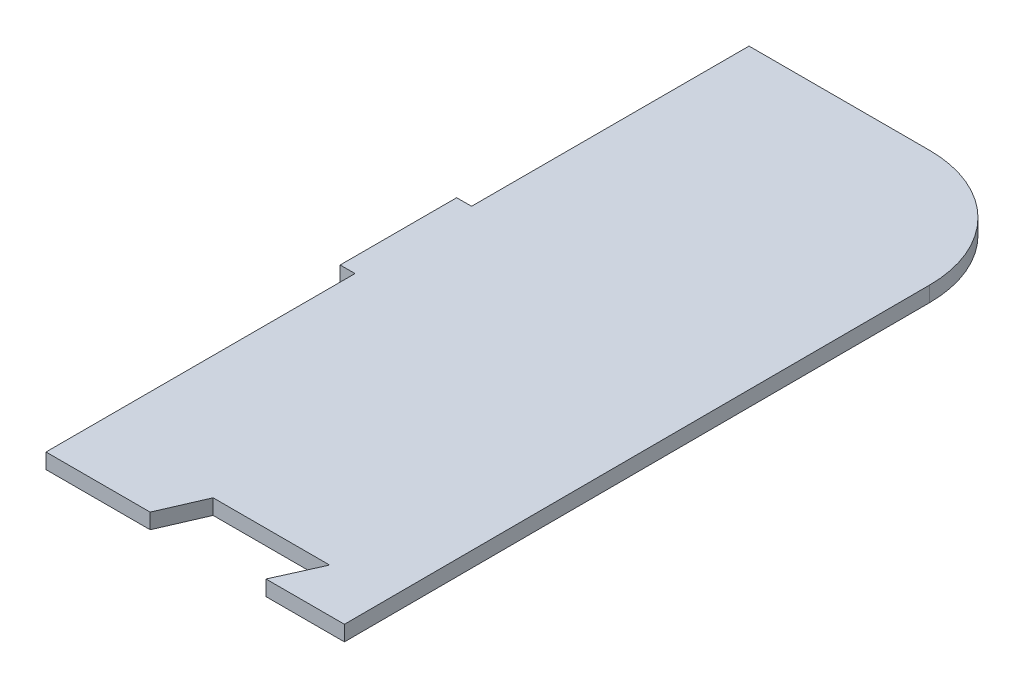
ISO-10303-21;
HEADER;
FILE_DESCRIPTION(('STEP AP214'),'2;1');
FILE_NAME('part.step','',(''),(''),'','','');
FILE_SCHEMA(('AUTOMOTIVE_DESIGN { 1 0 10303 214 1 1 1 1 }'));
ENDSEC;
DATA;
#1=APPLICATION_CONTEXT('core data for automotive mechanical design processes');
#2=APPLICATION_PROTOCOL_DEFINITION('international standard','automotive_design',2000,#1);
#3=PRODUCT_CONTEXT('',#1,'mechanical');
#4=PRODUCT('Part','Part','',(#3));
#5=PRODUCT_RELATED_PRODUCT_CATEGORY('part','',(#4));
#6=PRODUCT_DEFINITION_FORMATION('','',#4);
#7=PRODUCT_DEFINITION_CONTEXT('part definition',#1,'design');
#8=PRODUCT_DEFINITION('design','',#6,#7);
#9=PRODUCT_DEFINITION_SHAPE('','',#8);
#10=(LENGTH_UNIT() NAMED_UNIT(*) SI_UNIT(.MILLI.,.METRE.));
#11=(NAMED_UNIT(*) PLANE_ANGLE_UNIT() SI_UNIT($,.RADIAN.));
#12=(NAMED_UNIT(*) SI_UNIT($,.STERADIAN.) SOLID_ANGLE_UNIT());
#13=UNCERTAINTY_MEASURE_WITH_UNIT(LENGTH_MEASURE(1.E-05),#10,'distance_accuracy_value','');
#14=(GEOMETRIC_REPRESENTATION_CONTEXT(3) GLOBAL_UNCERTAINTY_ASSIGNED_CONTEXT((#13)) GLOBAL_UNIT_ASSIGNED_CONTEXT((#10,
#11,#12)) REPRESENTATION_CONTEXT('',''));
#15=CARTESIAN_POINT('',(0.,0.,0.));
#16=DIRECTION('',(0.,0.,1.));
#17=DIRECTION('',(1.,0.,0.));
#18=AXIS2_PLACEMENT_3D('',#15,#16,#17);
#19=CARTESIAN_POINT('',(358.121789204402,754.380000017288,884.700014425757));
#20=DIRECTION('',(0.,-1.,0.));
#21=DIRECTION('',(0.,0.,-1.));
#22=AXIS2_PLACEMENT_3D('',#19,#20,#21);
#23=PLANE('',#22);
#24=DIRECTION('',(-0.00203401334707627,0.,-0.999997931392712));
#25=VECTOR('',#24,1.);
#26=CARTESIAN_POINT('',(460.501916297315,754.380000017288,459.74));
#27=LINE('',#26,#25);
#28=CARTESIAN_POINT('',(460.501916297315,754.380000017288,459.739999999993));
#29=VERTEX_POINT('',#28);
#30=CARTESIAN_POINT('',(459.721789204401,754.380000017288,76.2000000000132));
#31=VERTEX_POINT('',#30);
#32=EDGE_CURVE('E111',#29,#31,#27,.T.);
#33=ORIENTED_EDGE('',*,*,#32,.T.);
#34=CARTESIAN_POINT('',(383.521789204401,754.380000017288,76.2000000000132));
#35=DIRECTION('',(0.,1.,0.));
#36=DIRECTION('',(0.,0.,1.));
#37=AXIS2_PLACEMENT_3D('',#34,#35,#36);
#38=CIRCLE('',#37,76.2);
#39=CARTESIAN_POINT('',(383.521789204398,754.380000017288,0.));
#40=VERTEX_POINT('',#39);
#41=EDGE_CURVE('E246',#31,#40,#38,.T.);
#42=ORIENTED_EDGE('',*,*,#41,.T.);
#43=DIRECTION('',(-1.,0.,0.));
#44=VECTOR('',#43,1.);
#45=CARTESIAN_POINT('',(358.121789204402,754.380000017288,0.));
#46=LINE('',#45,#44);
#47=CARTESIAN_POINT('',(265.355188860333,754.380000017288,0.));
#48=VERTEX_POINT('',#47);
#49=EDGE_CURVE('E216',#40,#48,#46,.T.);
#50=ORIENTED_EDGE('',*,*,#49,.T.);
#51=DIRECTION('',(0.,0.,-1.));
#52=VECTOR('',#51,1.);
#53=CARTESIAN_POINT('',(265.355188860333,754.380000017288,0.));
#54=LINE('',#53,#52);
#55=CARTESIAN_POINT('',(265.355188860333,754.380000017288,181.46005910007));
#56=VERTEX_POINT('',#55);
#57=EDGE_CURVE('E211',#56,#48,#54,.T.);
#58=ORIENTED_EDGE('',*,*,#57,.F.);
#59=DIRECTION('',(-1.,0.,0.));
#60=VECTOR('',#59,1.);
#61=CARTESIAN_POINT('',(0.,754.380000017288,181.46005910007));
#62=LINE('',#61,#60);
#63=CARTESIAN_POINT('',(255.630013474232,754.380000017288,181.46005910007));
#64=VERTEX_POINT('',#63);
#65=EDGE_CURVE('E195',#56,#64,#62,.T.);
#66=ORIENTED_EDGE('',*,*,#65,.T.);
#67=DIRECTION('',(0.,0.,1.));
#68=VECTOR('',#67,1.);
#69=CARTESIAN_POINT('',(255.630013474232,754.380000017288,0.));
#70=LINE('',#69,#68);
#71=CARTESIAN_POINT('',(255.630013474232,754.380000017288,257.66005910007));
#72=VERTEX_POINT('',#71);
#73=EDGE_CURVE('E209',#64,#72,#70,.T.);
#74=ORIENTED_EDGE('',*,*,#73,.T.);
#75=DIRECTION('',(-1.,0.,0.));
#76=VECTOR('',#75,1.);
#77=CARTESIAN_POINT('',(0.,754.380000017288,257.66005910007));
#78=LINE('',#77,#76);
#79=CARTESIAN_POINT('',(265.355188860333,754.380000017288,257.66005910007));
#80=VERTEX_POINT('',#79);
#81=EDGE_CURVE('E283',#80,#72,#78,.T.);
#82=ORIENTED_EDGE('',*,*,#81,.F.);
#83=DIRECTION('',(0.,0.,-1.));
#84=VECTOR('',#83,1.);
#85=CARTESIAN_POINT('',(265.355188860333,754.380000017288,0.));
#86=LINE('',#85,#84);
#87=CARTESIAN_POINT('',(265.355188860333,754.380000017288,459.739999999993));
#88=VERTEX_POINT('',#87);
#89=EDGE_CURVE('E212',#88,#80,#86,.T.);
#90=ORIENTED_EDGE('',*,*,#89,.F.);
#91=DIRECTION('',(-1.,0.,0.));
#92=VECTOR('',#91,1.);
#93=CARTESIAN_POINT('',(358.121789204402,754.380000017288,459.739999999993));
#94=LINE('',#93,#92);
#95=CARTESIAN_POINT('',(333.46423455215,754.380000017288,459.739999999993));
#96=VERTEX_POINT('',#95);
#97=EDGE_CURVE('E227',#96,#88,#94,.T.);
#98=ORIENTED_EDGE('',*,*,#97,.F.);
#99=DIRECTION('',(0.398405108065025,0.,-0.917209556136271));
#100=VECTOR('',#99,1.);
#101=CARTESIAN_POINT('',(333.464234552153,754.380000017288,459.74));
#102=LINE('',#101,#100);
#103=CARTESIAN_POINT('',(345.930527537437,754.380000017288,431.040059100068));
#104=VERTEX_POINT('',#103);
#105=EDGE_CURVE('E265',#96,#104,#102,.T.);
#106=ORIENTED_EDGE('',*,*,#105,.T.);
#107=DIRECTION('',(1.,0.,0.));
#108=VECTOR('',#107,1.);
#109=CARTESIAN_POINT('',(345.930527537437,754.380000017288,431.040059100068));
#110=LINE('',#109,#108);
#111=CARTESIAN_POINT('',(422.130527537437,754.380000017288,431.040059100068));
#112=VERTEX_POINT('',#111);
#113=EDGE_CURVE('E273',#104,#112,#110,.T.);
#114=ORIENTED_EDGE('',*,*,#113,.T.);
#115=DIRECTION('',(-0.410331561317546,0.,0.911936406657123));
#116=VECTOR('',#115,1.);
#117=CARTESIAN_POINT('',(422.130527537437,754.380000017288,431.040059100068));
#118=LINE('',#117,#116);
#119=CARTESIAN_POINT('',(409.216807377542,754.380000017288,459.739999999993));
#120=VERTEX_POINT('',#119);
#121=EDGE_CURVE('E276',#112,#120,#118,.T.);
#122=ORIENTED_EDGE('',*,*,#121,.T.);
#123=EDGE_CURVE('E233',#29,#120,#94,.T.);
#124=ORIENTED_EDGE('',*,*,#123,.F.);
#125=EDGE_LOOP('',(#33,#42,#50,#58,#66,#74,#82,#90,#98,#106,#114,#122,#124));
#126=FACE_BOUND('',#125,.T.);
#127=ADVANCED_FACE('F96',(#126),#23,.F.);
#128=CARTESIAN_POINT('',(562.803601280852,744.380000017288,884.700014425757));
#129=DIRECTION('',(0.,1.,0.));
#130=DIRECTION('',(0.,0.,1.));
#131=AXIS2_PLACEMENT_3D('',#128,#129,#130);
#132=PLANE('',#131);
#133=DIRECTION('',(-0.00203401334707627,0.,-0.999997931392713));
#134=VECTOR('',#133,1.);
#135=CARTESIAN_POINT('',(461.366712094164,744.380000017288,884.906338839052));
#136=LINE('',#135,#134);
#137=CARTESIAN_POINT('',(460.501916297315,744.380000017288,459.739999999993));
#138=VERTEX_POINT('',#137);
#139=CARTESIAN_POINT('',(459.721789204401,744.380000017288,76.2000000000132));
#140=VERTEX_POINT('',#139);
#141=EDGE_CURVE('E299',#138,#140,#136,.T.);
#142=ORIENTED_EDGE('',*,*,#141,.F.);
#143=DIRECTION('',(1.,0.,0.));
#144=VECTOR('',#143,1.);
#145=CARTESIAN_POINT('',(562.803601280852,744.380000017288,459.739999999993));
#146=LINE('',#145,#144);
#147=CARTESIAN_POINT('',(409.216807377545,744.380000017288,459.739999999993));
#148=VERTEX_POINT('',#147);
#149=EDGE_CURVE('E229',#148,#138,#146,.T.);
#150=ORIENTED_EDGE('',*,*,#149,.F.);
#151=DIRECTION('',(-0.410331561317546,0.,0.911936406657123));
#152=VECTOR('',#151,1.);
#153=CARTESIAN_POINT('',(276.058060925519,744.380000017288,755.677042630876));
#154=LINE('',#153,#152);
#155=CARTESIAN_POINT('',(422.130527537437,744.380000017288,431.040059100068));
#156=VERTEX_POINT('',#155);
#157=EDGE_CURVE('E119',#156,#148,#154,.T.);
#158=ORIENTED_EDGE('',*,*,#157,.F.);
#159=DIRECTION('',(1.,0.,0.));
#160=VECTOR('',#159,1.);
#161=CARTESIAN_POINT('',(562.803601280852,744.380000017288,431.040059100068));
#162=LINE('',#161,#160);
#163=CARTESIAN_POINT('',(345.930527537437,744.380000017288,431.040059100068));
#164=VERTEX_POINT('',#163);
#165=EDGE_CURVE('E12',#164,#156,#162,.T.);
#166=ORIENTED_EDGE('',*,*,#165,.F.);
#167=DIRECTION('',(0.398405108065025,0.,-0.917209556136271));
#168=VECTOR('',#167,1.);
#169=CARTESIAN_POINT('',(214.577197716529,744.380000017288,733.442129011262));
#170=LINE('',#169,#168);
#171=CARTESIAN_POINT('',(333.46423455215,744.380000017288,459.739999999993));
#172=VERTEX_POINT('',#171);
#173=EDGE_CURVE('E297',#172,#164,#170,.T.);
#174=ORIENTED_EDGE('',*,*,#173,.F.);
#175=CARTESIAN_POINT('',(265.355188860333,744.380000017288,459.739999999993));
#176=VERTEX_POINT('',#175);
#177=EDGE_CURVE('E232',#176,#172,#146,.T.);
#178=ORIENTED_EDGE('',*,*,#177,.F.);
#179=DIRECTION('',(0.,0.,-1.));
#180=VECTOR('',#179,1.);
#181=CARTESIAN_POINT('',(265.355188860333,744.380000017288,884.700014425757));
#182=LINE('',#181,#180);
#183=CARTESIAN_POINT('',(265.355188860333,744.380000017288,257.66005910007));
#184=VERTEX_POINT('',#183);
#185=EDGE_CURVE('E293',#176,#184,#182,.T.);
#186=ORIENTED_EDGE('',*,*,#185,.T.);
#187=DIRECTION('',(-1.,0.,0.));
#188=VECTOR('',#187,1.);
#189=CARTESIAN_POINT('',(562.803601280852,744.380000017288,257.66005910007));
#190=LINE('',#189,#188);
#191=CARTESIAN_POINT('',(255.630013474232,744.380000017288,257.66005910007));
#192=VERTEX_POINT('',#191);
#193=EDGE_CURVE('E288',#184,#192,#190,.T.);
#194=ORIENTED_EDGE('',*,*,#193,.T.);
#195=DIRECTION('',(0.,0.,1.));
#196=VECTOR('',#195,1.);
#197=CARTESIAN_POINT('',(255.630013474232,744.380000017288,0.));
#198=LINE('',#197,#196);
#199=CARTESIAN_POINT('',(255.630013474232,744.380000017288,181.46005910007));
#200=VERTEX_POINT('',#199);
#201=EDGE_CURVE('E217',#200,#192,#198,.T.);
#202=ORIENTED_EDGE('',*,*,#201,.F.);
#203=DIRECTION('',(-1.,0.,0.));
#204=VECTOR('',#203,1.);
#205=CARTESIAN_POINT('',(562.803601280852,744.380000017288,181.46005910007));
#206=LINE('',#205,#204);
#207=CARTESIAN_POINT('',(265.355188860333,744.380000017288,181.46005910007));
#208=VERTEX_POINT('',#207);
#209=EDGE_CURVE('E198',#208,#200,#206,.T.);
#210=ORIENTED_EDGE('',*,*,#209,.F.);
#211=DIRECTION('',(0.,0.,-1.));
#212=VECTOR('',#211,1.);
#213=CARTESIAN_POINT('',(265.355188860333,744.380000017288,884.700014425757));
#214=LINE('',#213,#212);
#215=CARTESIAN_POINT('',(265.355188860333,744.380000017288,0.));
#216=VERTEX_POINT('',#215);
#217=EDGE_CURVE('E300',#208,#216,#214,.T.);
#218=ORIENTED_EDGE('',*,*,#217,.T.);
#219=DIRECTION('',(1.,0.,0.));
#220=VECTOR('',#219,1.);
#221=CARTESIAN_POINT('',(562.803601280852,744.380000017288,0.));
#222=LINE('',#221,#220);
#223=CARTESIAN_POINT('',(383.521789204398,744.380000017288,0.));
#224=VERTEX_POINT('',#223);
#225=EDGE_CURVE('E219',#216,#224,#222,.T.);
#226=ORIENTED_EDGE('',*,*,#225,.T.);
#227=CARTESIAN_POINT('',(383.521789204401,744.380000017288,76.2000000000132));
#228=DIRECTION('',(0.,1.,0.));
#229=DIRECTION('',(0.,0.,1.));
#230=AXIS2_PLACEMENT_3D('',#227,#228,#229);
#231=CIRCLE('',#230,76.2);
#232=EDGE_CURVE('E221',#140,#224,#231,.T.);
#233=ORIENTED_EDGE('',*,*,#232,.F.);
#234=EDGE_LOOP('',(#142,#150,#158,#166,#174,#178,#186,#194,#202,#210,#218,#226,#233));
#235=FACE_BOUND('',#234,.T.);
#236=ADVANCED_FACE('F303',(#235),#132,.F.);
#237=CARTESIAN_POINT('',(-0.0522024421950805,0.751580454716461,459.739999999993));
#238=DIRECTION('',(0.,0.,1.));
#239=DIRECTION('',(1.,0.,0.));
#240=AXIS2_PLACEMENT_3D('',#237,#238,#239);
#241=PLANE('',#240);
#242=ORIENTED_EDGE('',*,*,#149,.T.);
#243=DIRECTION('',(0.,1.,0.));
#244=VECTOR('',#243,1.);
#245=CARTESIAN_POINT('',(460.501916297315,0.751580454716461,459.739999999993));
#246=LINE('',#245,#244);
#247=EDGE_CURVE('E239',#138,#29,#246,.T.);
#248=ORIENTED_EDGE('',*,*,#247,.T.);
#249=ORIENTED_EDGE('',*,*,#123,.T.);
#250=DIRECTION('',(0.,-1.,0.));
#251=VECTOR('',#250,1.);
#252=CARTESIAN_POINT('',(409.216807377545,691.380000017288,459.739999999993));
#253=LINE('',#252,#251);
#254=EDGE_CURVE('E270',#120,#148,#253,.T.);
#255=ORIENTED_EDGE('',*,*,#254,.T.);
#256=EDGE_LOOP('',(#242,#248,#249,#255));
#257=FACE_BOUND('',#256,.T.);
#258=ADVANCED_FACE('F98',(#257),#241,.T.);
#259=ORIENTED_EDGE('',*,*,#177,.T.);
#260=DIRECTION('',(0.,1.,0.));
#261=VECTOR('',#260,1.);
#262=CARTESIAN_POINT('',(333.464234552156,0.751580454716461,459.739999999993));
#263=LINE('',#262,#261);
#264=EDGE_CURVE('E203',#172,#96,#263,.T.);
#265=ORIENTED_EDGE('',*,*,#264,.T.);
#266=ORIENTED_EDGE('',*,*,#97,.T.);
#267=DIRECTION('',(0.,1.,0.));
#268=VECTOR('',#267,1.);
#269=CARTESIAN_POINT('',(265.355188860333,691.380000017288,459.739999999993));
#270=LINE('',#269,#268);
#271=EDGE_CURVE('E286',#176,#88,#270,.T.);
#272=ORIENTED_EDGE('',*,*,#271,.F.);
#273=EDGE_LOOP('',(#259,#265,#266,#272));
#274=FACE_BOUND('',#273,.T.);
#275=ADVANCED_FACE('F328',(#274),#241,.T.);
#276=CARTESIAN_POINT('',(255.630013474232,754.380000017288,0.));
#277=DIRECTION('',(1.,0.,0.));
#278=DIRECTION('',(0.,0.,-1.));
#279=AXIS2_PLACEMENT_3D('',#276,#277,#278);
#280=PLANE('',#279);
#281=DIRECTION('',(0.,1.,0.));
#282=VECTOR('',#281,1.);
#283=CARTESIAN_POINT('',(255.630013474232,754.380000017288,181.46005910007));
#284=LINE('',#283,#282);
#285=EDGE_CURVE('E191',#200,#64,#284,.T.);
#286=ORIENTED_EDGE('',*,*,#285,.F.);
#287=ORIENTED_EDGE('',*,*,#201,.T.);
#288=DIRECTION('',(0.,1.,0.));
#289=VECTOR('',#288,1.);
#290=CARTESIAN_POINT('',(255.630013474232,754.380000017288,257.66005910007));
#291=LINE('',#290,#289);
#292=EDGE_CURVE('E204',#192,#72,#291,.T.);
#293=ORIENTED_EDGE('',*,*,#292,.T.);
#294=ORIENTED_EDGE('',*,*,#73,.F.);
#295=EDGE_LOOP('',(#286,#287,#293,#294));
#296=FACE_BOUND('',#295,.T.);
#297=ADVANCED_FACE('F215',(#296),#280,.F.);
#298=CARTESIAN_POINT('',(0.,0.,0.));
#299=DIRECTION('',(0.,0.,-1.));
#300=DIRECTION('',(-1.,0.,0.));
#301=AXIS2_PLACEMENT_3D('',#298,#299,#300);
#302=PLANE('',#301);
#303=DIRECTION('',(0.,1.,0.));
#304=VECTOR('',#303,1.);
#305=CARTESIAN_POINT('',(383.521789204401,691.380000017288,6.60582699651968E-12));
#306=LINE('',#305,#304);
#307=EDGE_CURVE('E104',#224,#40,#306,.T.);
#308=ORIENTED_EDGE('',*,*,#307,.F.);
#309=ORIENTED_EDGE('',*,*,#225,.F.);
#310=DIRECTION('',(0.,1.,0.));
#311=VECTOR('',#310,1.);
#312=CARTESIAN_POINT('',(265.355188860333,691.380000017288,0.));
#313=LINE('',#312,#311);
#314=EDGE_CURVE('E252',#216,#48,#313,.T.);
#315=ORIENTED_EDGE('',*,*,#314,.T.);
#316=ORIENTED_EDGE('',*,*,#49,.F.);
#317=EDGE_LOOP('',(#308,#309,#315,#316));
#318=FACE_BOUND('',#317,.T.);
#319=ADVANCED_FACE('F255',(#318),#302,.T.);
#320=CARTESIAN_POINT('',(265.355188860333,691.380000017288,0.));
#321=DIRECTION('',(1.,0.,0.));
#322=DIRECTION('',(0.,0.,-1.));
#323=AXIS2_PLACEMENT_3D('',#320,#321,#322);
#324=PLANE('',#323);
#325=ORIENTED_EDGE('',*,*,#271,.T.);
#326=ORIENTED_EDGE('',*,*,#89,.T.);
#327=DIRECTION('',(0.,1.,0.));
#328=VECTOR('',#327,1.);
#329=CARTESIAN_POINT('',(265.355188860333,691.380000017288,257.66005910007));
#330=LINE('',#329,#328);
#331=EDGE_CURVE('E285',#184,#80,#330,.T.);
#332=ORIENTED_EDGE('',*,*,#331,.F.);
#333=ORIENTED_EDGE('',*,*,#185,.F.);
#334=EDGE_LOOP('',(#325,#326,#332,#333));
#335=FACE_BOUND('',#334,.T.);
#336=ADVANCED_FACE('F314',(#335),#324,.F.);
#337=CARTESIAN_POINT('',(0.,691.380000017288,257.66005910007));
#338=DIRECTION('',(0.,0.,-1.));
#339=DIRECTION('',(-1.,0.,0.));
#340=AXIS2_PLACEMENT_3D('',#337,#338,#339);
#341=PLANE('',#340);
#342=ORIENTED_EDGE('',*,*,#331,.T.);
#343=ORIENTED_EDGE('',*,*,#81,.T.);
#344=ORIENTED_EDGE('',*,*,#292,.F.);
#345=ORIENTED_EDGE('',*,*,#193,.F.);
#346=EDGE_LOOP('',(#342,#343,#344,#345));
#347=FACE_BOUND('',#346,.T.);
#348=ADVANCED_FACE('F306',(#347),#341,.F.);
#349=CARTESIAN_POINT('',(265.355188860333,691.380000017288,0.));
#350=DIRECTION('',(1.,0.,0.));
#351=DIRECTION('',(0.,0.,-1.));
#352=AXIS2_PLACEMENT_3D('',#349,#350,#351);
#353=PLANE('',#352);
#354=DIRECTION('',(0.,1.,0.));
#355=VECTOR('',#354,1.);
#356=CARTESIAN_POINT('',(265.355188860333,691.380000017288,181.46005910007));
#357=LINE('',#356,#355);
#358=EDGE_CURVE('E258',#208,#56,#357,.T.);
#359=ORIENTED_EDGE('',*,*,#358,.T.);
#360=ORIENTED_EDGE('',*,*,#57,.T.);
#361=ORIENTED_EDGE('',*,*,#314,.F.);
#362=ORIENTED_EDGE('',*,*,#217,.F.);
#363=EDGE_LOOP('',(#359,#360,#361,#362));
#364=FACE_BOUND('',#363,.T.);
#365=ADVANCED_FACE('F304',(#364),#353,.F.);
#366=CARTESIAN_POINT('',(0.,691.380000017288,181.46005910007));
#367=DIRECTION('',(0.,0.,-1.));
#368=DIRECTION('',(-1.,0.,0.));
#369=AXIS2_PLACEMENT_3D('',#366,#367,#368);
#370=PLANE('',#369);
#371=ORIENTED_EDGE('',*,*,#209,.T.);
#372=ORIENTED_EDGE('',*,*,#285,.T.);
#373=ORIENTED_EDGE('',*,*,#65,.F.);
#374=ORIENTED_EDGE('',*,*,#358,.F.);
#375=EDGE_LOOP('',(#371,#372,#373,#374));
#376=FACE_BOUND('',#375,.T.);
#377=ADVANCED_FACE('F193',(#376),#370,.T.);
#378=CARTESIAN_POINT('',(422.130527537437,691.380000017288,431.040059100068));
#379=DIRECTION('',(-0.911936406657123,0.,-0.410331561317546));
#380=DIRECTION('',(-0.410331561317546,0.,0.911936406657123));
#381=AXIS2_PLACEMENT_3D('',#378,#379,#380);
#382=PLANE('',#381);
#383=ORIENTED_EDGE('',*,*,#157,.T.);
#384=ORIENTED_EDGE('',*,*,#254,.F.);
#385=ORIENTED_EDGE('',*,*,#121,.F.);
#386=DIRECTION('',(0.,1.,0.));
#387=VECTOR('',#386,1.);
#388=CARTESIAN_POINT('',(422.130527537437,691.380000017288,431.040059100068));
#389=LINE('',#388,#387);
#390=EDGE_CURVE('E266',#156,#112,#389,.T.);
#391=ORIENTED_EDGE('',*,*,#390,.F.);
#392=EDGE_LOOP('',(#383,#384,#385,#391));
#393=FACE_BOUND('',#392,.T.);
#394=ADVANCED_FACE('F312',(#393),#382,.T.);
#395=CARTESIAN_POINT('',(333.464234552153,691.380000017288,459.74));
#396=DIRECTION('',(0.917209556136271,0.,0.398405108065025));
#397=DIRECTION('',(0.398405108065025,0.,-0.917209556136271));
#398=AXIS2_PLACEMENT_3D('',#395,#396,#397);
#399=PLANE('',#398);
#400=ORIENTED_EDGE('',*,*,#173,.T.);
#401=DIRECTION('',(0.,1.,0.));
#402=VECTOR('',#401,1.);
#403=CARTESIAN_POINT('',(345.930527537437,691.380000017288,431.040059100068));
#404=LINE('',#403,#402);
#405=EDGE_CURVE('E268',#164,#104,#404,.T.);
#406=ORIENTED_EDGE('',*,*,#405,.T.);
#407=ORIENTED_EDGE('',*,*,#105,.F.);
#408=ORIENTED_EDGE('',*,*,#264,.F.);
#409=EDGE_LOOP('',(#400,#406,#407,#408));
#410=FACE_BOUND('',#409,.T.);
#411=ADVANCED_FACE('F332',(#410),#399,.T.);
#412=CARTESIAN_POINT('',(345.930527537437,691.380000017288,431.040059100068));
#413=DIRECTION('',(0.,0.,1.));
#414=DIRECTION('',(1.,0.,0.));
#415=AXIS2_PLACEMENT_3D('',#412,#413,#414);
#416=PLANE('',#415);
#417=ORIENTED_EDGE('',*,*,#165,.T.);
#418=ORIENTED_EDGE('',*,*,#390,.T.);
#419=ORIENTED_EDGE('',*,*,#113,.F.);
#420=ORIENTED_EDGE('',*,*,#405,.F.);
#421=EDGE_LOOP('',(#417,#418,#419,#420));
#422=FACE_BOUND('',#421,.T.);
#423=ADVANCED_FACE('F335',(#422),#416,.T.);
#424=CARTESIAN_POINT('',(383.521789204401,691.380000017288,76.2000000000132));
#425=DIRECTION('',(0.,1.,0.));
#426=DIRECTION('',(0.,0.,1.));
#427=AXIS2_PLACEMENT_3D('',#424,#425,#426);
#428=CYLINDRICAL_SURFACE('',#427,76.2);
#429=ORIENTED_EDGE('',*,*,#232,.T.);
#430=ORIENTED_EDGE('',*,*,#307,.T.);
#431=ORIENTED_EDGE('',*,*,#41,.F.);
#432=DIRECTION('',(0.,1.,0.));
#433=VECTOR('',#432,1.);
#434=CARTESIAN_POINT('',(459.721789204401,691.380000017288,76.2000000000132));
#435=LINE('',#434,#433);
#436=EDGE_CURVE('E263',#140,#31,#435,.T.);
#437=ORIENTED_EDGE('',*,*,#436,.F.);
#438=EDGE_LOOP('',(#429,#430,#431,#437));
#439=FACE_BOUND('',#438,.T.);
#440=ADVANCED_FACE('F244',(#439),#428,.T.);
#441=CARTESIAN_POINT('',(460.501916297315,691.380000017288,459.74));
#442=DIRECTION('',(0.999997931392712,0.,-0.00203401334707627));
#443=DIRECTION('',(-0.00203401334707627,0.,-0.999997931392713));
#444=AXIS2_PLACEMENT_3D('',#441,#442,#443);
#445=PLANE('',#444);
#446=ORIENTED_EDGE('',*,*,#141,.T.);
#447=ORIENTED_EDGE('',*,*,#436,.T.);
#448=ORIENTED_EDGE('',*,*,#32,.F.);
#449=ORIENTED_EDGE('',*,*,#247,.F.);
#450=EDGE_LOOP('',(#446,#447,#448,#449));
#451=FACE_BOUND('',#450,.T.);
#452=ADVANCED_FACE('F342',(#451),#445,.T.);
#453=CLOSED_SHELL('',(#127,#236,#258,#275,#297,#319,#336,#348,#365,#377,#394,#411,#423,#440,#452));
#454=MANIFOLD_SOLID_BREP('B2',#453);
#455=ADVANCED_BREP_SHAPE_REPRESENTATION('',(#18,#454),#14);
#456=SHAPE_DEFINITION_REPRESENTATION(#9,#455);
ENDSEC;
END-ISO-10303-21;
